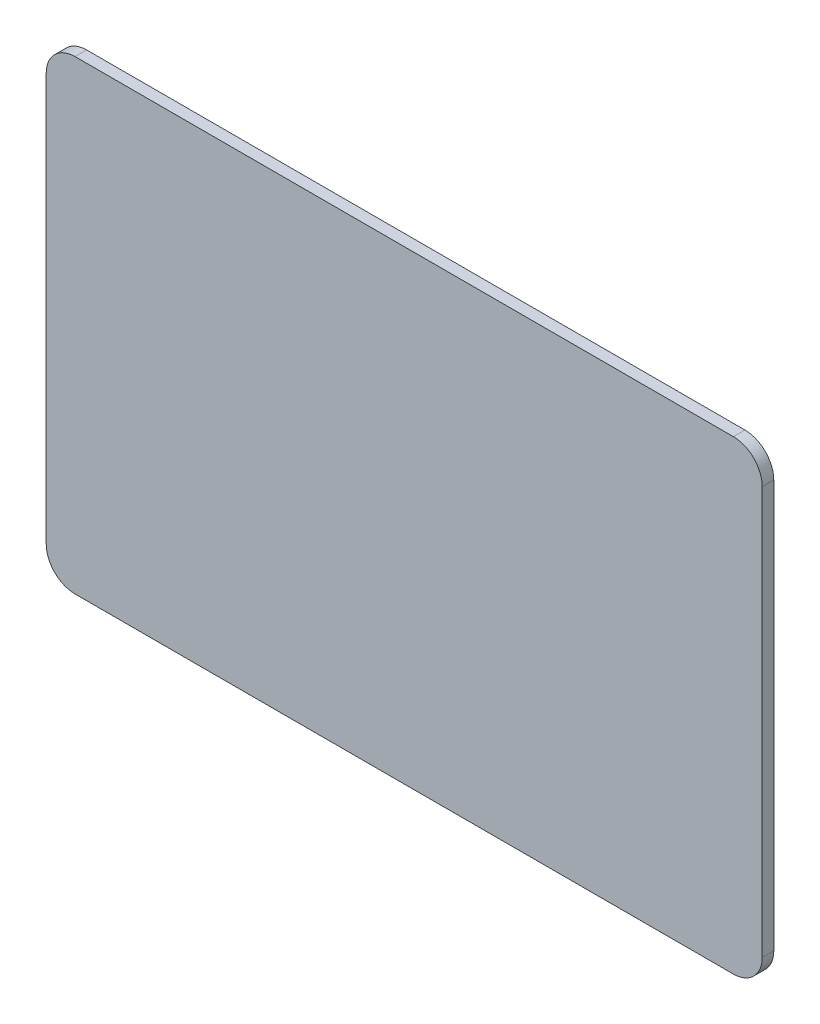
ISO-10303-21;
HEADER;
FILE_DESCRIPTION(('STEP AP214'),'2;1');
FILE_NAME('part.step','',(''),(''),'','','');
FILE_SCHEMA(('AUTOMOTIVE_DESIGN { 1 0 10303 214 1 1 1 1 }'));
ENDSEC;
DATA;
#1=APPLICATION_CONTEXT('core data for automotive mechanical design processes');
#2=APPLICATION_PROTOCOL_DEFINITION('international standard','automotive_design',2000,#1);
#3=PRODUCT_CONTEXT('',#1,'mechanical');
#4=PRODUCT('Part','Part','',(#3));
#5=PRODUCT_RELATED_PRODUCT_CATEGORY('part','',(#4));
#6=PRODUCT_DEFINITION_FORMATION('','',#4);
#7=PRODUCT_DEFINITION_CONTEXT('part definition',#1,'design');
#8=PRODUCT_DEFINITION('design','',#6,#7);
#9=PRODUCT_DEFINITION_SHAPE('','',#8);
#10=(LENGTH_UNIT() NAMED_UNIT(*) SI_UNIT(.MILLI.,.METRE.));
#11=(NAMED_UNIT(*) PLANE_ANGLE_UNIT() SI_UNIT($,.RADIAN.));
#12=(NAMED_UNIT(*) SI_UNIT($,.STERADIAN.) SOLID_ANGLE_UNIT());
#13=UNCERTAINTY_MEASURE_WITH_UNIT(LENGTH_MEASURE(1.E-05),#10,'distance_accuracy_value','');
#14=(GEOMETRIC_REPRESENTATION_CONTEXT(3) GLOBAL_UNCERTAINTY_ASSIGNED_CONTEXT((#13)) GLOBAL_UNIT_ASSIGNED_CONTEXT((#10,
#11,#12)) REPRESENTATION_CONTEXT('',''));
#15=CARTESIAN_POINT('',(0.,0.,0.));
#16=DIRECTION('',(0.,0.,1.));
#17=DIRECTION('',(1.,0.,0.));
#18=AXIS2_PLACEMENT_3D('',#15,#16,#17);
#19=CARTESIAN_POINT('',(29.6484397051906,-17.5285714285714,1.));
#20=DIRECTION('',(0.,0.,-1.));
#21=DIRECTION('',(-1.,0.,0.));
#22=AXIS2_PLACEMENT_3D('',#19,#20,#21);
#23=CYLINDRICAL_SURFACE('',#22,2.5);
#24=CARTESIAN_POINT('',(29.6484397051906,-17.5285714285714,0.));
#25=DIRECTION('',(0.,0.,1.));
#26=DIRECTION('',(1.,0.,0.));
#27=AXIS2_PLACEMENT_3D('',#24,#25,#26);
#28=CIRCLE('',#27,2.5);
#29=CARTESIAN_POINT('',(29.6484397051906,-20.0285714285714,0.));
#30=VERTEX_POINT('',#29);
#31=CARTESIAN_POINT('',(32.1484397051906,-17.5285714285714,0.));
#32=VERTEX_POINT('',#31);
#33=EDGE_CURVE('E135',#30,#32,#28,.T.);
#34=ORIENTED_EDGE('',*,*,#33,.T.);
#35=DIRECTION('',(0.,0.,-1.));
#36=VECTOR('',#35,1.);
#37=CARTESIAN_POINT('',(32.1484397051906,-17.5285714285714,1.));
#38=LINE('',#37,#36);
#39=CARTESIAN_POINT('',(32.1484397051906,-17.5285714285714,1.));
#40=VERTEX_POINT('',#39);
#41=EDGE_CURVE('E11',#40,#32,#38,.T.);
#42=ORIENTED_EDGE('',*,*,#41,.F.);
#43=CARTESIAN_POINT('',(29.6484397051906,-17.5285714285714,1.));
#44=DIRECTION('',(0.,0.,1.));
#45=DIRECTION('',(1.,0.,0.));
#46=AXIS2_PLACEMENT_3D('',#43,#44,#45);
#47=CIRCLE('',#46,2.5);
#48=CARTESIAN_POINT('',(29.6484397051906,-20.0285714285714,1.));
#49=VERTEX_POINT('',#48);
#50=EDGE_CURVE('E149',#49,#40,#47,.T.);
#51=ORIENTED_EDGE('',*,*,#50,.F.);
#52=DIRECTION('',(0.,0.,-1.));
#53=VECTOR('',#52,1.);
#54=CARTESIAN_POINT('',(29.6484397051906,-20.0285714285714,1.));
#55=LINE('',#54,#53);
#56=EDGE_CURVE('E131',#49,#30,#55,.T.);
#57=ORIENTED_EDGE('',*,*,#56,.T.);
#58=EDGE_LOOP('',(#34,#42,#51,#57));
#59=FACE_BOUND('',#58,.T.);
#60=ADVANCED_FACE('F39',(#59),#23,.T.);
#61=CARTESIAN_POINT('',(32.1484397051906,-17.5285714285714,1.));
#62=DIRECTION('',(-1.,0.,0.));
#63=DIRECTION('',(0.,0.,1.));
#64=AXIS2_PLACEMENT_3D('',#61,#62,#63);
#65=PLANE('',#64);
#66=DIRECTION('',(0.,1.,0.));
#67=VECTOR('',#66,1.);
#68=CARTESIAN_POINT('',(32.1484397051906,-17.5285714285714,0.));
#69=LINE('',#68,#67);
#70=CARTESIAN_POINT('',(32.1484397051906,17.7714285714286,0.));
#71=VERTEX_POINT('',#70);
#72=EDGE_CURVE('E138',#32,#71,#69,.T.);
#73=ORIENTED_EDGE('',*,*,#72,.T.);
#74=DIRECTION('',(0.,0.,-1.));
#75=VECTOR('',#74,1.);
#76=CARTESIAN_POINT('',(32.1484397051906,17.7714285714286,1.));
#77=LINE('',#76,#75);
#78=CARTESIAN_POINT('',(32.1484397051906,17.7714285714286,1.));
#79=VERTEX_POINT('',#78);
#80=EDGE_CURVE('E47',#79,#71,#77,.T.);
#81=ORIENTED_EDGE('',*,*,#80,.F.);
#82=DIRECTION('',(0.,1.,0.));
#83=VECTOR('',#82,1.);
#84=CARTESIAN_POINT('',(32.1484397051906,-17.5285714285714,1.));
#85=LINE('',#84,#83);
#86=EDGE_CURVE('E98',#40,#79,#85,.T.);
#87=ORIENTED_EDGE('',*,*,#86,.F.);
#88=ORIENTED_EDGE('',*,*,#41,.T.);
#89=EDGE_LOOP('',(#73,#81,#87,#88));
#90=FACE_BOUND('',#89,.T.);
#91=ADVANCED_FACE('F184',(#90),#65,.F.);
#92=CARTESIAN_POINT('',(29.6484397051906,17.7714285714286,1.));
#93=DIRECTION('',(0.,0.,-1.));
#94=DIRECTION('',(-1.,0.,0.));
#95=AXIS2_PLACEMENT_3D('',#92,#93,#94);
#96=CYLINDRICAL_SURFACE('',#95,2.5);
#97=CARTESIAN_POINT('',(29.6484397051906,17.7714285714286,0.));
#98=DIRECTION('',(0.,0.,1.));
#99=DIRECTION('',(1.,0.,0.));
#100=AXIS2_PLACEMENT_3D('',#97,#98,#99);
#101=CIRCLE('',#100,2.5);
#102=CARTESIAN_POINT('',(29.6484397051906,20.2714285714286,0.));
#103=VERTEX_POINT('',#102);
#104=EDGE_CURVE('E140',#71,#103,#101,.T.);
#105=ORIENTED_EDGE('',*,*,#104,.T.);
#106=DIRECTION('',(0.,0.,-1.));
#107=VECTOR('',#106,1.);
#108=CARTESIAN_POINT('',(29.6484397051906,20.2714285714286,1.));
#109=LINE('',#108,#107);
#110=CARTESIAN_POINT('',(29.6484397051906,20.2714285714286,1.));
#111=VERTEX_POINT('',#110);
#112=EDGE_CURVE('E156',#111,#103,#109,.T.);
#113=ORIENTED_EDGE('',*,*,#112,.F.);
#114=CARTESIAN_POINT('',(29.6484397051906,17.7714285714286,1.));
#115=DIRECTION('',(0.,0.,1.));
#116=DIRECTION('',(1.,0.,0.));
#117=AXIS2_PLACEMENT_3D('',#114,#115,#116);
#118=CIRCLE('',#117,2.5);
#119=EDGE_CURVE('E164',#79,#111,#118,.T.);
#120=ORIENTED_EDGE('',*,*,#119,.F.);
#121=ORIENTED_EDGE('',*,*,#80,.T.);
#122=EDGE_LOOP('',(#105,#113,#120,#121));
#123=FACE_BOUND('',#122,.T.);
#124=ADVANCED_FACE('F162',(#123),#96,.T.);
#125=CARTESIAN_POINT('',(29.6484397051906,20.2714285714286,1.));
#126=DIRECTION('',(0.,-1.,0.));
#127=DIRECTION('',(0.,0.,-1.));
#128=AXIS2_PLACEMENT_3D('',#125,#126,#127);
#129=PLANE('',#128);
#130=DIRECTION('',(-1.,0.,0.));
#131=VECTOR('',#130,1.);
#132=CARTESIAN_POINT('',(29.6484397051906,20.2714285714286,0.));
#133=LINE('',#132,#131);
#134=CARTESIAN_POINT('',(-27.3515602948094,20.2714285714286,0.));
#135=VERTEX_POINT('',#134);
#136=EDGE_CURVE('E142',#103,#135,#133,.T.);
#137=ORIENTED_EDGE('',*,*,#136,.T.);
#138=DIRECTION('',(0.,0.,-1.));
#139=VECTOR('',#138,1.);
#140=CARTESIAN_POINT('',(-27.3515602948094,20.2714285714286,1.));
#141=LINE('',#140,#139);
#142=CARTESIAN_POINT('',(-27.3515602948094,20.2714285714286,1.));
#143=VERTEX_POINT('',#142);
#144=EDGE_CURVE('E153',#143,#135,#141,.T.);
#145=ORIENTED_EDGE('',*,*,#144,.F.);
#146=DIRECTION('',(-1.,0.,0.));
#147=VECTOR('',#146,1.);
#148=CARTESIAN_POINT('',(29.6484397051906,20.2714285714286,1.));
#149=LINE('',#148,#147);
#150=EDGE_CURVE('E176',#111,#143,#149,.T.);
#151=ORIENTED_EDGE('',*,*,#150,.F.);
#152=ORIENTED_EDGE('',*,*,#112,.T.);
#153=EDGE_LOOP('',(#137,#145,#151,#152));
#154=FACE_BOUND('',#153,.T.);
#155=ADVANCED_FACE('F172',(#154),#129,.F.);
#156=CARTESIAN_POINT('',(-27.3515602948094,17.7714285714286,1.));
#157=DIRECTION('',(0.,0.,-1.));
#158=DIRECTION('',(-1.,0.,0.));
#159=AXIS2_PLACEMENT_3D('',#156,#157,#158);
#160=CYLINDRICAL_SURFACE('',#159,2.5);
#161=CARTESIAN_POINT('',(-27.3515602948094,17.7714285714286,0.));
#162=DIRECTION('',(0.,0.,1.));
#163=DIRECTION('',(1.,0.,0.));
#164=AXIS2_PLACEMENT_3D('',#161,#162,#163);
#165=CIRCLE('',#164,2.5);
#166=CARTESIAN_POINT('',(-29.8515602948094,17.7714285714286,0.));
#167=VERTEX_POINT('',#166);
#168=EDGE_CURVE('E144',#135,#167,#165,.T.);
#169=ORIENTED_EDGE('',*,*,#168,.T.);
#170=DIRECTION('',(0.,0.,-1.));
#171=VECTOR('',#170,1.);
#172=CARTESIAN_POINT('',(-29.8515602948094,17.7714285714286,1.));
#173=LINE('',#172,#171);
#174=CARTESIAN_POINT('',(-29.8515602948094,17.7714285714286,1.));
#175=VERTEX_POINT('',#174);
#176=EDGE_CURVE('E126',#175,#167,#173,.T.);
#177=ORIENTED_EDGE('',*,*,#176,.F.);
#178=CARTESIAN_POINT('',(-27.3515602948094,17.7714285714286,1.));
#179=DIRECTION('',(0.,0.,1.));
#180=DIRECTION('',(1.,0.,0.));
#181=AXIS2_PLACEMENT_3D('',#178,#179,#180);
#182=CIRCLE('',#181,2.5);
#183=EDGE_CURVE('E117',#143,#175,#182,.T.);
#184=ORIENTED_EDGE('',*,*,#183,.F.);
#185=ORIENTED_EDGE('',*,*,#144,.T.);
#186=EDGE_LOOP('',(#169,#177,#184,#185));
#187=FACE_BOUND('',#186,.T.);
#188=ADVANCED_FACE('F175',(#187),#160,.T.);
#189=CARTESIAN_POINT('',(-29.8515602948094,17.7714285714286,1.));
#190=DIRECTION('',(1.,0.,0.));
#191=DIRECTION('',(0.,0.,-1.));
#192=AXIS2_PLACEMENT_3D('',#189,#190,#191);
#193=PLANE('',#192);
#194=DIRECTION('',(0.,-1.,0.));
#195=VECTOR('',#194,1.);
#196=CARTESIAN_POINT('',(-29.8515602948094,17.7714285714286,0.));
#197=LINE('',#196,#195);
#198=CARTESIAN_POINT('',(-29.8515602948094,-17.5285714285714,0.));
#199=VERTEX_POINT('',#198);
#200=EDGE_CURVE('E125',#167,#199,#197,.T.);
#201=ORIENTED_EDGE('',*,*,#200,.T.);
#202=DIRECTION('',(0.,0.,-1.));
#203=VECTOR('',#202,1.);
#204=CARTESIAN_POINT('',(-29.8515602948094,-17.5285714285714,1.));
#205=LINE('',#204,#203);
#206=CARTESIAN_POINT('',(-29.8515602948094,-17.5285714285714,1.));
#207=VERTEX_POINT('',#206);
#208=EDGE_CURVE('E122',#207,#199,#205,.T.);
#209=ORIENTED_EDGE('',*,*,#208,.F.);
#210=DIRECTION('',(0.,-1.,0.));
#211=VECTOR('',#210,1.);
#212=CARTESIAN_POINT('',(-29.8515602948094,17.7714285714286,1.));
#213=LINE('',#212,#211);
#214=EDGE_CURVE('E111',#175,#207,#213,.T.);
#215=ORIENTED_EDGE('',*,*,#214,.F.);
#216=ORIENTED_EDGE('',*,*,#176,.T.);
#217=EDGE_LOOP('',(#201,#209,#215,#216));
#218=FACE_BOUND('',#217,.T.);
#219=ADVANCED_FACE('F123',(#218),#193,.F.);
#220=CARTESIAN_POINT('',(-27.3515602948094,-17.5285714285714,1.));
#221=DIRECTION('',(0.,0.,-1.));
#222=DIRECTION('',(-1.,0.,0.));
#223=AXIS2_PLACEMENT_3D('',#220,#221,#222);
#224=CYLINDRICAL_SURFACE('',#223,2.5);
#225=CARTESIAN_POINT('',(-27.3515602948094,-17.5285714285714,0.));
#226=DIRECTION('',(0.,0.,1.));
#227=DIRECTION('',(1.,0.,0.));
#228=AXIS2_PLACEMENT_3D('',#225,#226,#227);
#229=CIRCLE('',#228,2.5);
#230=CARTESIAN_POINT('',(-27.3515602948094,-20.0285714285714,0.));
#231=VERTEX_POINT('',#230);
#232=EDGE_CURVE('E84',#199,#231,#229,.T.);
#233=ORIENTED_EDGE('',*,*,#232,.T.);
#234=DIRECTION('',(0.,0.,-1.));
#235=VECTOR('',#234,1.);
#236=CARTESIAN_POINT('',(-27.3515602948094,-20.0285714285714,1.));
#237=LINE('',#236,#235);
#238=CARTESIAN_POINT('',(-27.3515602948094,-20.0285714285714,1.));
#239=VERTEX_POINT('',#238);
#240=EDGE_CURVE('E127',#239,#231,#237,.T.);
#241=ORIENTED_EDGE('',*,*,#240,.F.);
#242=CARTESIAN_POINT('',(-27.3515602948094,-17.5285714285714,1.));
#243=DIRECTION('',(0.,0.,1.));
#244=DIRECTION('',(1.,0.,0.));
#245=AXIS2_PLACEMENT_3D('',#242,#243,#244);
#246=CIRCLE('',#245,2.5);
#247=EDGE_CURVE('E115',#207,#239,#246,.T.);
#248=ORIENTED_EDGE('',*,*,#247,.F.);
#249=ORIENTED_EDGE('',*,*,#208,.T.);
#250=EDGE_LOOP('',(#233,#241,#248,#249));
#251=FACE_BOUND('',#250,.T.);
#252=ADVANCED_FACE('F129',(#251),#224,.T.);
#253=CARTESIAN_POINT('',(-27.3515602948094,-20.0285714285714,1.));
#254=DIRECTION('',(0.,1.,0.));
#255=DIRECTION('',(0.,0.,1.));
#256=AXIS2_PLACEMENT_3D('',#253,#254,#255);
#257=PLANE('',#256);
#258=DIRECTION('',(1.,0.,0.));
#259=VECTOR('',#258,1.);
#260=CARTESIAN_POINT('',(-27.3515602948094,-20.0285714285714,0.));
#261=LINE('',#260,#259);
#262=EDGE_CURVE('E90',#231,#30,#261,.T.);
#263=ORIENTED_EDGE('',*,*,#262,.T.);
#264=ORIENTED_EDGE('',*,*,#56,.F.);
#265=DIRECTION('',(1.,0.,0.));
#266=VECTOR('',#265,1.);
#267=CARTESIAN_POINT('',(-27.3515602948094,-20.0285714285714,1.));
#268=LINE('',#267,#266);
#269=EDGE_CURVE('E55',#239,#49,#268,.T.);
#270=ORIENTED_EDGE('',*,*,#269,.F.);
#271=ORIENTED_EDGE('',*,*,#240,.T.);
#272=EDGE_LOOP('',(#263,#264,#270,#271));
#273=FACE_BOUND('',#272,.T.);
#274=ADVANCED_FACE('F200',(#273),#257,.F.);
#275=CARTESIAN_POINT('',(29.6484397051906,-17.5285714285714,1.));
#276=DIRECTION('',(0.,0.,1.));
#277=DIRECTION('',(1.,0.,0.));
#278=AXIS2_PLACEMENT_3D('',#275,#276,#277);
#279=PLANE('',#278);
#280=ORIENTED_EDGE('',*,*,#50,.T.);
#281=ORIENTED_EDGE('',*,*,#86,.T.);
#282=ORIENTED_EDGE('',*,*,#119,.T.);
#283=ORIENTED_EDGE('',*,*,#150,.T.);
#284=ORIENTED_EDGE('',*,*,#183,.T.);
#285=ORIENTED_EDGE('',*,*,#214,.T.);
#286=ORIENTED_EDGE('',*,*,#247,.T.);
#287=ORIENTED_EDGE('',*,*,#269,.T.);
#288=EDGE_LOOP('',(#280,#281,#282,#283,#284,#285,#286,#287));
#289=FACE_BOUND('',#288,.T.);
#290=ADVANCED_FACE('F113',(#289),#279,.T.);
#291=CARTESIAN_POINT('',(29.6484397051906,-17.5285714285714,0.));
#292=DIRECTION('',(0.,0.,1.));
#293=DIRECTION('',(1.,0.,0.));
#294=AXIS2_PLACEMENT_3D('',#291,#292,#293);
#295=PLANE('',#294);
#296=ORIENTED_EDGE('',*,*,#33,.F.);
#297=ORIENTED_EDGE('',*,*,#262,.F.);
#298=ORIENTED_EDGE('',*,*,#232,.F.);
#299=ORIENTED_EDGE('',*,*,#200,.F.);
#300=ORIENTED_EDGE('',*,*,#168,.F.);
#301=ORIENTED_EDGE('',*,*,#136,.F.);
#302=ORIENTED_EDGE('',*,*,#104,.F.);
#303=ORIENTED_EDGE('',*,*,#72,.F.);
#304=EDGE_LOOP('',(#296,#297,#298,#299,#300,#301,#302,#303));
#305=FACE_BOUND('',#304,.T.);
#306=ADVANCED_FACE('F168',(#305),#295,.F.);
#307=CLOSED_SHELL('',(#60,#91,#124,#155,#188,#219,#252,#274,#290,#306));
#308=MANIFOLD_SOLID_BREP('B2',#307);
#309=ADVANCED_BREP_SHAPE_REPRESENTATION('',(#18,#308),#14);
#310=SHAPE_DEFINITION_REPRESENTATION(#9,#309);
ENDSEC;
END-ISO-10303-21;
